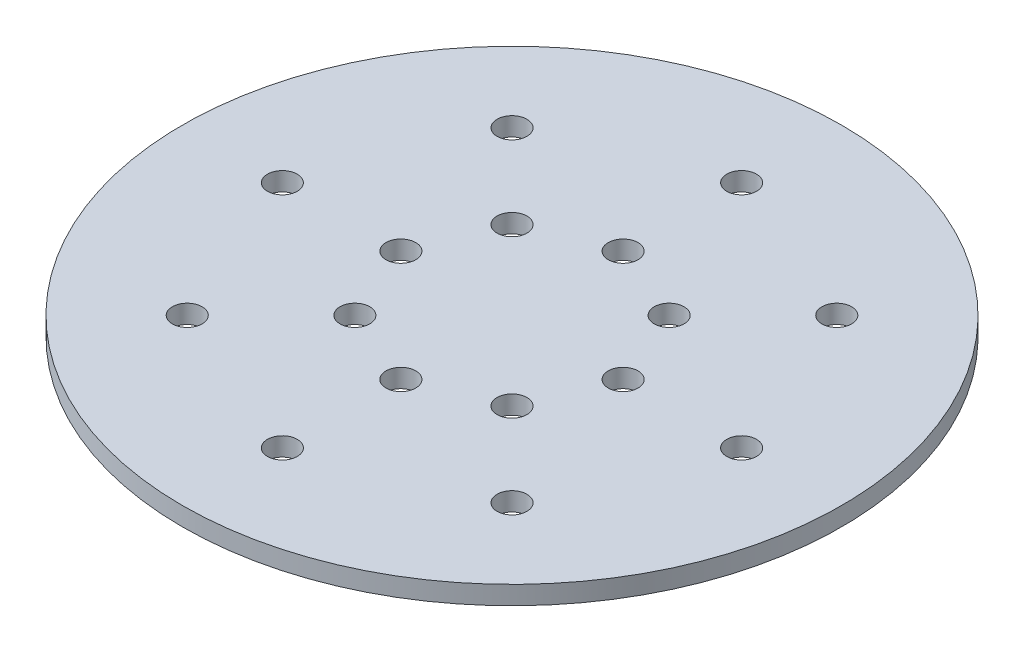
ISO-10303-21;
HEADER;
FILE_DESCRIPTION(('STEP AP214'),'2;1');
FILE_NAME('part.step','',(''),(''),'','','');
FILE_SCHEMA(('AUTOMOTIVE_DESIGN { 1 0 10303 214 1 1 1 1 }'));
ENDSEC;
DATA;
#1=APPLICATION_CONTEXT('core data for automotive mechanical design processes');
#2=APPLICATION_PROTOCOL_DEFINITION('international standard','automotive_design',2000,#1);
#3=PRODUCT_CONTEXT('',#1,'mechanical');
#4=PRODUCT('Part','Part','',(#3));
#5=PRODUCT_RELATED_PRODUCT_CATEGORY('part','',(#4));
#6=PRODUCT_DEFINITION_FORMATION('','',#4);
#7=PRODUCT_DEFINITION_CONTEXT('part definition',#1,'design');
#8=PRODUCT_DEFINITION('design','',#6,#7);
#9=PRODUCT_DEFINITION_SHAPE('','',#8);
#10=(LENGTH_UNIT() NAMED_UNIT(*) SI_UNIT(.MILLI.,.METRE.));
#11=(NAMED_UNIT(*) PLANE_ANGLE_UNIT() SI_UNIT($,.RADIAN.));
#12=(NAMED_UNIT(*) SI_UNIT($,.STERADIAN.) SOLID_ANGLE_UNIT());
#13=UNCERTAINTY_MEASURE_WITH_UNIT(LENGTH_MEASURE(1.E-05),#10,'distance_accuracy_value','');
#14=(GEOMETRIC_REPRESENTATION_CONTEXT(3) GLOBAL_UNCERTAINTY_ASSIGNED_CONTEXT((#13)) GLOBAL_UNIT_ASSIGNED_CONTEXT((#10,
#11,#12)) REPRESENTATION_CONTEXT('',''));
#15=CARTESIAN_POINT('',(0.,0.,0.));
#16=DIRECTION('',(0.,0.,1.));
#17=DIRECTION('',(1.,0.,0.));
#18=AXIS2_PLACEMENT_3D('',#15,#16,#17);
#19=CARTESIAN_POINT('',(0.,3.175,0.));
#20=DIRECTION('',(0.,-1.,0.));
#21=DIRECTION('',(0.,0.,-1.));
#22=AXIS2_PLACEMENT_3D('',#19,#20,#21);
#23=CYLINDRICAL_SURFACE('',#22,56.5);
#24=CARTESIAN_POINT('',(0.,3.175,0.));
#25=DIRECTION('',(0.,1.,0.));
#26=DIRECTION('',(0.,0.,1.));
#27=AXIS2_PLACEMENT_3D('',#24,#25,#26);
#28=CIRCLE('',#27,56.5);
#29=CARTESIAN_POINT('',(0.,3.175,56.5));
#30=VERTEX_POINT('',#29);
#31=EDGE_CURVE('E10',#30,#30,#28,.T.);
#32=ORIENTED_EDGE('',*,*,#31,.F.);
#33=EDGE_LOOP('',(#32));
#34=FACE_BOUND('',#33,.T.);
#35=CARTESIAN_POINT('',(0.,0.,0.));
#36=DIRECTION('',(0.,1.,0.));
#37=DIRECTION('',(0.,0.,1.));
#38=AXIS2_PLACEMENT_3D('',#35,#36,#37);
#39=CIRCLE('',#38,56.5);
#40=CARTESIAN_POINT('',(0.,0.,56.5));
#41=VERTEX_POINT('',#40);
#42=EDGE_CURVE('E39',#41,#41,#39,.T.);
#43=ORIENTED_EDGE('',*,*,#42,.T.);
#44=EDGE_LOOP('',(#43));
#45=FACE_BOUND('',#44,.T.);
#46=ADVANCED_FACE('F36',(#34,#45),#23,.T.);
#47=CARTESIAN_POINT('',(0.,3.175,0.));
#48=DIRECTION('',(0.,1.,0.));
#49=DIRECTION('',(0.,0.,1.));
#50=AXIS2_PLACEMENT_3D('',#47,#48,#49);
#51=PLANE('',#50);
#52=CARTESIAN_POINT('',(13.4703841816037,3.175,-13.4703841816037));
#53=DIRECTION('',(0.,-1.,0.));
#54=DIRECTION('',(0.,0.,-1.));
#55=AXIS2_PLACEMENT_3D('',#52,#53,#54);
#56=CIRCLE('',#55,2.5527);
#57=CARTESIAN_POINT('',(13.4703841816037,3.175,-16.0230841816037));
#58=VERTEX_POINT('',#57);
#59=EDGE_CURVE('E137',#58,#58,#56,.T.);
#60=ORIENTED_EDGE('',*,*,#59,.T.);
#61=EDGE_LOOP('',(#60));
#62=FACE_BOUND('',#61,.T.);
#63=CARTESIAN_POINT('',(19.05,3.175,0.));
#64=DIRECTION('',(0.,-1.,0.));
#65=DIRECTION('',(0.,0.,-1.));
#66=AXIS2_PLACEMENT_3D('',#63,#64,#65);
#67=CIRCLE('',#66,2.5527);
#68=CARTESIAN_POINT('',(19.05,3.175,-2.5527));
#69=VERTEX_POINT('',#68);
#70=EDGE_CURVE('E131',#69,#69,#67,.T.);
#71=ORIENTED_EDGE('',*,*,#70,.T.);
#72=EDGE_LOOP('',(#71));
#73=FACE_BOUND('',#72,.T.);
#74=CARTESIAN_POINT('',(13.4703841816037,3.175,13.4703841816037));
#75=DIRECTION('',(0.,-1.,0.));
#76=DIRECTION('',(0.,0.,-1.));
#77=AXIS2_PLACEMENT_3D('',#74,#75,#76);
#78=CIRCLE('',#77,2.5527);
#79=CARTESIAN_POINT('',(13.4703841816037,3.175,10.9176841816037));
#80=VERTEX_POINT('',#79);
#81=EDGE_CURVE('E125',#80,#80,#78,.T.);
#82=ORIENTED_EDGE('',*,*,#81,.T.);
#83=EDGE_LOOP('',(#82));
#84=FACE_BOUND('',#83,.T.);
#85=CARTESIAN_POINT('',(0.,3.175,19.05));
#86=DIRECTION('',(0.,-1.,0.));
#87=DIRECTION('',(0.,0.,-1.));
#88=AXIS2_PLACEMENT_3D('',#85,#86,#87);
#89=CIRCLE('',#88,2.5527);
#90=CARTESIAN_POINT('',(0.,3.175,16.4973));
#91=VERTEX_POINT('',#90);
#92=EDGE_CURVE('E119',#91,#91,#89,.T.);
#93=ORIENTED_EDGE('',*,*,#92,.T.);
#94=EDGE_LOOP('',(#93));
#95=FACE_BOUND('',#94,.T.);
#96=CARTESIAN_POINT('',(-13.4703841816037,3.175,13.4703841816037));
#97=DIRECTION('',(0.,-1.,0.));
#98=DIRECTION('',(0.,0.,-1.));
#99=AXIS2_PLACEMENT_3D('',#96,#97,#98);
#100=CIRCLE('',#99,2.5527);
#101=CARTESIAN_POINT('',(-13.4703841816037,3.175,10.9176841816037));
#102=VERTEX_POINT('',#101);
#103=EDGE_CURVE('E113',#102,#102,#100,.T.);
#104=ORIENTED_EDGE('',*,*,#103,.T.);
#105=EDGE_LOOP('',(#104));
#106=FACE_BOUND('',#105,.T.);
#107=CARTESIAN_POINT('',(-19.05,3.175,0.));
#108=DIRECTION('',(0.,-1.,0.));
#109=DIRECTION('',(0.,0.,-1.));
#110=AXIS2_PLACEMENT_3D('',#107,#108,#109);
#111=CIRCLE('',#110,2.5527);
#112=CARTESIAN_POINT('',(-19.05,3.175,-2.55269999999999));
#113=VERTEX_POINT('',#112);
#114=EDGE_CURVE('E107',#113,#113,#111,.T.);
#115=ORIENTED_EDGE('',*,*,#114,.T.);
#116=EDGE_LOOP('',(#115));
#117=FACE_BOUND('',#116,.T.);
#118=CARTESIAN_POINT('',(-13.4703841816037,3.175,-13.4703841816037));
#119=DIRECTION('',(0.,-1.,0.));
#120=DIRECTION('',(0.,0.,-1.));
#121=AXIS2_PLACEMENT_3D('',#118,#119,#120);
#122=CIRCLE('',#121,2.5527);
#123=CARTESIAN_POINT('',(-13.4703841816037,3.175,-16.0230841816037));
#124=VERTEX_POINT('',#123);
#125=EDGE_CURVE('E101',#124,#124,#122,.T.);
#126=ORIENTED_EDGE('',*,*,#125,.T.);
#127=EDGE_LOOP('',(#126));
#128=FACE_BOUND('',#127,.T.);
#129=CARTESIAN_POINT('',(0.,3.175,-19.05));
#130=DIRECTION('',(0.,-1.,0.));
#131=DIRECTION('',(0.,0.,-1.));
#132=AXIS2_PLACEMENT_3D('',#129,#130,#131);
#133=CIRCLE('',#132,2.5527);
#134=CARTESIAN_POINT('',(0.,3.175,-21.6027));
#135=VERTEX_POINT('',#134);
#136=EDGE_CURVE('E95',#135,#135,#133,.T.);
#137=ORIENTED_EDGE('',*,*,#136,.T.);
#138=EDGE_LOOP('',(#137));
#139=FACE_BOUND('',#138,.T.);
#140=CARTESIAN_POINT('',(0.,3.175,-39.37));
#141=DIRECTION('',(0.,-1.,0.));
#142=DIRECTION('',(0.,0.,-1.));
#143=AXIS2_PLACEMENT_3D('',#140,#141,#142);
#144=CIRCLE('',#143,2.5527);
#145=CARTESIAN_POINT('',(0.,3.175,-41.9227));
#146=VERTEX_POINT('',#145);
#147=EDGE_CURVE('E89',#146,#146,#144,.T.);
#148=ORIENTED_EDGE('',*,*,#147,.T.);
#149=EDGE_LOOP('',(#148));
#150=FACE_BOUND('',#149,.T.);
#151=CARTESIAN_POINT('',(-27.8387939753144,3.175,-27.8387939753144));
#152=DIRECTION('',(0.,-1.,0.));
#153=DIRECTION('',(0.,0.,-1.));
#154=AXIS2_PLACEMENT_3D('',#151,#152,#153);
#155=CIRCLE('',#154,2.5527);
#156=CARTESIAN_POINT('',(-27.8387939753144,3.175,-30.3914939753144));
#157=VERTEX_POINT('',#156);
#158=EDGE_CURVE('E83',#157,#157,#155,.T.);
#159=ORIENTED_EDGE('',*,*,#158,.T.);
#160=EDGE_LOOP('',(#159));
#161=FACE_BOUND('',#160,.T.);
#162=CARTESIAN_POINT('',(-39.37,3.175,0.));
#163=DIRECTION('',(0.,-1.,0.));
#164=DIRECTION('',(0.,0.,-1.));
#165=AXIS2_PLACEMENT_3D('',#162,#163,#164);
#166=CIRCLE('',#165,2.5527);
#167=CARTESIAN_POINT('',(-39.37,3.175,-2.55269999999999));
#168=VERTEX_POINT('',#167);
#169=EDGE_CURVE('E77',#168,#168,#166,.T.);
#170=ORIENTED_EDGE('',*,*,#169,.T.);
#171=EDGE_LOOP('',(#170));
#172=FACE_BOUND('',#171,.T.);
#173=CARTESIAN_POINT('',(-27.8387939753144,3.175,27.8387939753144));
#174=DIRECTION('',(0.,-1.,0.));
#175=DIRECTION('',(0.,0.,-1.));
#176=AXIS2_PLACEMENT_3D('',#173,#174,#175);
#177=CIRCLE('',#176,2.5527);
#178=CARTESIAN_POINT('',(-27.8387939753144,3.175,25.2860939753144));
#179=VERTEX_POINT('',#178);
#180=EDGE_CURVE('E71',#179,#179,#177,.T.);
#181=ORIENTED_EDGE('',*,*,#180,.T.);
#182=EDGE_LOOP('',(#181));
#183=FACE_BOUND('',#182,.T.);
#184=CARTESIAN_POINT('',(0.,3.175,39.37));
#185=DIRECTION('',(0.,-1.,0.));
#186=DIRECTION('',(0.,0.,-1.));
#187=AXIS2_PLACEMENT_3D('',#184,#185,#186);
#188=CIRCLE('',#187,2.5527);
#189=CARTESIAN_POINT('',(0.,3.175,36.8173));
#190=VERTEX_POINT('',#189);
#191=EDGE_CURVE('E65',#190,#190,#188,.T.);
#192=ORIENTED_EDGE('',*,*,#191,.T.);
#193=EDGE_LOOP('',(#192));
#194=FACE_BOUND('',#193,.T.);
#195=CARTESIAN_POINT('',(27.8387939753144,3.175,27.8387939753144));
#196=DIRECTION('',(0.,-1.,0.));
#197=DIRECTION('',(0.,0.,-1.));
#198=AXIS2_PLACEMENT_3D('',#195,#196,#197);
#199=CIRCLE('',#198,2.5527);
#200=CARTESIAN_POINT('',(27.8387939753144,3.175,25.2860939753144));
#201=VERTEX_POINT('',#200);
#202=EDGE_CURVE('E59',#201,#201,#199,.T.);
#203=ORIENTED_EDGE('',*,*,#202,.T.);
#204=EDGE_LOOP('',(#203));
#205=FACE_BOUND('',#204,.T.);
#206=CARTESIAN_POINT('',(39.37,3.175,0.));
#207=DIRECTION('',(0.,-1.,0.));
#208=DIRECTION('',(0.,0.,-1.));
#209=AXIS2_PLACEMENT_3D('',#206,#207,#208);
#210=CIRCLE('',#209,2.5527);
#211=CARTESIAN_POINT('',(39.37,3.175,-2.5527));
#212=VERTEX_POINT('',#211);
#213=EDGE_CURVE('E53',#212,#212,#210,.T.);
#214=ORIENTED_EDGE('',*,*,#213,.T.);
#215=EDGE_LOOP('',(#214));
#216=FACE_BOUND('',#215,.T.);
#217=CARTESIAN_POINT('',(27.8387939753144,3.175,-27.8387939753144));
#218=DIRECTION('',(0.,-1.,0.));
#219=DIRECTION('',(0.,0.,-1.));
#220=AXIS2_PLACEMENT_3D('',#217,#218,#219);
#221=CIRCLE('',#220,2.5527);
#222=CARTESIAN_POINT('',(27.8387939753144,3.175,-30.3914939753144));
#223=VERTEX_POINT('',#222);
#224=EDGE_CURVE('E46',#223,#223,#221,.T.);
#225=ORIENTED_EDGE('',*,*,#224,.T.);
#226=EDGE_LOOP('',(#225));
#227=FACE_BOUND('',#226,.T.);
#228=ORIENTED_EDGE('',*,*,#31,.T.);
#229=EDGE_LOOP('',(#228));
#230=FACE_BOUND('',#229,.T.);
#231=ADVANCED_FACE('F150',(#62,#73,#84,#95,#106,#117,#128,#139,#150,#161,#172,#183,#194,#205,
#216,#227,#230),#51,.T.);
#232=CARTESIAN_POINT('',(0.,0.,0.));
#233=DIRECTION('',(0.,1.,0.));
#234=DIRECTION('',(0.,0.,1.));
#235=AXIS2_PLACEMENT_3D('',#232,#233,#234);
#236=PLANE('',#235);
#237=CARTESIAN_POINT('',(13.4703841816037,0.,-13.4703841816037));
#238=DIRECTION('',(0.,-1.,0.));
#239=DIRECTION('',(0.,0.,-1.));
#240=AXIS2_PLACEMENT_3D('',#237,#238,#239);
#241=CIRCLE('',#240,2.5527);
#242=CARTESIAN_POINT('',(13.4703841816037,0.,-16.0230841816037));
#243=VERTEX_POINT('',#242);
#244=EDGE_CURVE('E140',#243,#243,#241,.T.);
#245=ORIENTED_EDGE('',*,*,#244,.F.);
#246=EDGE_LOOP('',(#245));
#247=FACE_BOUND('',#246,.T.);
#248=CARTESIAN_POINT('',(19.05,0.,0.));
#249=DIRECTION('',(0.,-1.,0.));
#250=DIRECTION('',(0.,0.,-1.));
#251=AXIS2_PLACEMENT_3D('',#248,#249,#250);
#252=CIRCLE('',#251,2.5527);
#253=CARTESIAN_POINT('',(19.05,0.,-2.5527));
#254=VERTEX_POINT('',#253);
#255=EDGE_CURVE('E134',#254,#254,#252,.T.);
#256=ORIENTED_EDGE('',*,*,#255,.F.);
#257=EDGE_LOOP('',(#256));
#258=FACE_BOUND('',#257,.T.);
#259=CARTESIAN_POINT('',(13.4703841816037,0.,13.4703841816037));
#260=DIRECTION('',(0.,-1.,0.));
#261=DIRECTION('',(0.,0.,-1.));
#262=AXIS2_PLACEMENT_3D('',#259,#260,#261);
#263=CIRCLE('',#262,2.5527);
#264=CARTESIAN_POINT('',(13.4703841816037,0.,10.9176841816037));
#265=VERTEX_POINT('',#264);
#266=EDGE_CURVE('E128',#265,#265,#263,.T.);
#267=ORIENTED_EDGE('',*,*,#266,.F.);
#268=EDGE_LOOP('',(#267));
#269=FACE_BOUND('',#268,.T.);
#270=CARTESIAN_POINT('',(0.,0.,19.05));
#271=DIRECTION('',(0.,-1.,0.));
#272=DIRECTION('',(0.,0.,-1.));
#273=AXIS2_PLACEMENT_3D('',#270,#271,#272);
#274=CIRCLE('',#273,2.5527);
#275=CARTESIAN_POINT('',(0.,0.,16.4973));
#276=VERTEX_POINT('',#275);
#277=EDGE_CURVE('E122',#276,#276,#274,.T.);
#278=ORIENTED_EDGE('',*,*,#277,.F.);
#279=EDGE_LOOP('',(#278));
#280=FACE_BOUND('',#279,.T.);
#281=CARTESIAN_POINT('',(-13.4703841816037,0.,13.4703841816037));
#282=DIRECTION('',(0.,-1.,0.));
#283=DIRECTION('',(0.,0.,-1.));
#284=AXIS2_PLACEMENT_3D('',#281,#282,#283);
#285=CIRCLE('',#284,2.5527);
#286=CARTESIAN_POINT('',(-13.4703841816037,0.,10.9176841816037));
#287=VERTEX_POINT('',#286);
#288=EDGE_CURVE('E116',#287,#287,#285,.T.);
#289=ORIENTED_EDGE('',*,*,#288,.F.);
#290=EDGE_LOOP('',(#289));
#291=FACE_BOUND('',#290,.T.);
#292=CARTESIAN_POINT('',(-19.05,0.,0.));
#293=DIRECTION('',(0.,-1.,0.));
#294=DIRECTION('',(0.,0.,-1.));
#295=AXIS2_PLACEMENT_3D('',#292,#293,#294);
#296=CIRCLE('',#295,2.5527);
#297=CARTESIAN_POINT('',(-19.05,0.,-2.55269999999999));
#298=VERTEX_POINT('',#297);
#299=EDGE_CURVE('E110',#298,#298,#296,.T.);
#300=ORIENTED_EDGE('',*,*,#299,.F.);
#301=EDGE_LOOP('',(#300));
#302=FACE_BOUND('',#301,.T.);
#303=CARTESIAN_POINT('',(-13.4703841816037,0.,-13.4703841816037));
#304=DIRECTION('',(0.,-1.,0.));
#305=DIRECTION('',(0.,0.,-1.));
#306=AXIS2_PLACEMENT_3D('',#303,#304,#305);
#307=CIRCLE('',#306,2.5527);
#308=CARTESIAN_POINT('',(-13.4703841816037,0.,-16.0230841816037));
#309=VERTEX_POINT('',#308);
#310=EDGE_CURVE('E104',#309,#309,#307,.T.);
#311=ORIENTED_EDGE('',*,*,#310,.F.);
#312=EDGE_LOOP('',(#311));
#313=FACE_BOUND('',#312,.T.);
#314=CARTESIAN_POINT('',(0.,0.,-19.05));
#315=DIRECTION('',(0.,-1.,0.));
#316=DIRECTION('',(0.,0.,-1.));
#317=AXIS2_PLACEMENT_3D('',#314,#315,#316);
#318=CIRCLE('',#317,2.5527);
#319=CARTESIAN_POINT('',(0.,0.,-21.6027));
#320=VERTEX_POINT('',#319);
#321=EDGE_CURVE('E98',#320,#320,#318,.T.);
#322=ORIENTED_EDGE('',*,*,#321,.F.);
#323=EDGE_LOOP('',(#322));
#324=FACE_BOUND('',#323,.T.);
#325=CARTESIAN_POINT('',(0.,0.,-39.37));
#326=DIRECTION('',(0.,-1.,0.));
#327=DIRECTION('',(0.,0.,-1.));
#328=AXIS2_PLACEMENT_3D('',#325,#326,#327);
#329=CIRCLE('',#328,2.5527);
#330=CARTESIAN_POINT('',(0.,0.,-41.9227));
#331=VERTEX_POINT('',#330);
#332=EDGE_CURVE('E92',#331,#331,#329,.T.);
#333=ORIENTED_EDGE('',*,*,#332,.F.);
#334=EDGE_LOOP('',(#333));
#335=FACE_BOUND('',#334,.T.);
#336=CARTESIAN_POINT('',(-27.8387939753144,0.,-27.8387939753144));
#337=DIRECTION('',(0.,-1.,0.));
#338=DIRECTION('',(0.,0.,-1.));
#339=AXIS2_PLACEMENT_3D('',#336,#337,#338);
#340=CIRCLE('',#339,2.5527);
#341=CARTESIAN_POINT('',(-27.8387939753144,0.,-30.3914939753144));
#342=VERTEX_POINT('',#341);
#343=EDGE_CURVE('E86',#342,#342,#340,.T.);
#344=ORIENTED_EDGE('',*,*,#343,.F.);
#345=EDGE_LOOP('',(#344));
#346=FACE_BOUND('',#345,.T.);
#347=CARTESIAN_POINT('',(-39.37,0.,0.));
#348=DIRECTION('',(0.,-1.,0.));
#349=DIRECTION('',(0.,0.,-1.));
#350=AXIS2_PLACEMENT_3D('',#347,#348,#349);
#351=CIRCLE('',#350,2.5527);
#352=CARTESIAN_POINT('',(-39.37,0.,-2.55269999999999));
#353=VERTEX_POINT('',#352);
#354=EDGE_CURVE('E80',#353,#353,#351,.T.);
#355=ORIENTED_EDGE('',*,*,#354,.F.);
#356=EDGE_LOOP('',(#355));
#357=FACE_BOUND('',#356,.T.);
#358=CARTESIAN_POINT('',(-27.8387939753144,0.,27.8387939753144));
#359=DIRECTION('',(0.,-1.,0.));
#360=DIRECTION('',(0.,0.,-1.));
#361=AXIS2_PLACEMENT_3D('',#358,#359,#360);
#362=CIRCLE('',#361,2.5527);
#363=CARTESIAN_POINT('',(-27.8387939753144,0.,25.2860939753144));
#364=VERTEX_POINT('',#363);
#365=EDGE_CURVE('E74',#364,#364,#362,.T.);
#366=ORIENTED_EDGE('',*,*,#365,.F.);
#367=EDGE_LOOP('',(#366));
#368=FACE_BOUND('',#367,.T.);
#369=CARTESIAN_POINT('',(0.,0.,39.37));
#370=DIRECTION('',(0.,-1.,0.));
#371=DIRECTION('',(0.,0.,-1.));
#372=AXIS2_PLACEMENT_3D('',#369,#370,#371);
#373=CIRCLE('',#372,2.5527);
#374=CARTESIAN_POINT('',(0.,0.,36.8173));
#375=VERTEX_POINT('',#374);
#376=EDGE_CURVE('E68',#375,#375,#373,.T.);
#377=ORIENTED_EDGE('',*,*,#376,.F.);
#378=EDGE_LOOP('',(#377));
#379=FACE_BOUND('',#378,.T.);
#380=CARTESIAN_POINT('',(27.8387939753144,0.,27.8387939753144));
#381=DIRECTION('',(0.,-1.,0.));
#382=DIRECTION('',(0.,0.,-1.));
#383=AXIS2_PLACEMENT_3D('',#380,#381,#382);
#384=CIRCLE('',#383,2.5527);
#385=CARTESIAN_POINT('',(27.8387939753144,0.,25.2860939753144));
#386=VERTEX_POINT('',#385);
#387=EDGE_CURVE('E62',#386,#386,#384,.T.);
#388=ORIENTED_EDGE('',*,*,#387,.F.);
#389=EDGE_LOOP('',(#388));
#390=FACE_BOUND('',#389,.T.);
#391=CARTESIAN_POINT('',(39.37,0.,0.));
#392=DIRECTION('',(0.,-1.,0.));
#393=DIRECTION('',(0.,0.,-1.));
#394=AXIS2_PLACEMENT_3D('',#391,#392,#393);
#395=CIRCLE('',#394,2.5527);
#396=CARTESIAN_POINT('',(39.37,0.,-2.5527));
#397=VERTEX_POINT('',#396);
#398=EDGE_CURVE('E56',#397,#397,#395,.T.);
#399=ORIENTED_EDGE('',*,*,#398,.F.);
#400=EDGE_LOOP('',(#399));
#401=FACE_BOUND('',#400,.T.);
#402=CARTESIAN_POINT('',(27.8387939753144,0.,-27.8387939753144));
#403=DIRECTION('',(0.,-1.,0.));
#404=DIRECTION('',(0.,0.,-1.));
#405=AXIS2_PLACEMENT_3D('',#402,#403,#404);
#406=CIRCLE('',#405,2.5527);
#407=CARTESIAN_POINT('',(27.8387939753144,0.,-30.3914939753144));
#408=VERTEX_POINT('',#407);
#409=EDGE_CURVE('E50',#408,#408,#406,.T.);
#410=ORIENTED_EDGE('',*,*,#409,.F.);
#411=EDGE_LOOP('',(#410));
#412=FACE_BOUND('',#411,.T.);
#413=ORIENTED_EDGE('',*,*,#42,.F.);
#414=EDGE_LOOP('',(#413));
#415=FACE_BOUND('',#414,.T.);
#416=ADVANCED_FACE('F146',(#247,#258,#269,#280,#291,#302,#313,#324,#335,#346,#357,#368,#379,
#390,#401,#412,#415),#236,.F.);
#417=CARTESIAN_POINT('',(27.8387939753144,0.,-27.8387939753144));
#418=DIRECTION('',(0.,-1.,0.));
#419=DIRECTION('',(0.,0.,-1.));
#420=AXIS2_PLACEMENT_3D('',#417,#418,#419);
#421=CYLINDRICAL_SURFACE('',#420,2.5527);
#422=ORIENTED_EDGE('',*,*,#224,.F.);
#423=EDGE_LOOP('',(#422));
#424=FACE_BOUND('',#423,.T.);
#425=ORIENTED_EDGE('',*,*,#409,.T.);
#426=EDGE_LOOP('',(#425));
#427=FACE_BOUND('',#426,.T.);
#428=ADVANCED_FACE('F149',(#424,#427),#421,.F.);
#429=CARTESIAN_POINT('',(39.37,0.,0.));
#430=DIRECTION('',(0.,-1.,0.));
#431=DIRECTION('',(0.,0.,-1.));
#432=AXIS2_PLACEMENT_3D('',#429,#430,#431);
#433=CYLINDRICAL_SURFACE('',#432,2.5527);
#434=ORIENTED_EDGE('',*,*,#213,.F.);
#435=EDGE_LOOP('',(#434));
#436=FACE_BOUND('',#435,.T.);
#437=ORIENTED_EDGE('',*,*,#398,.T.);
#438=EDGE_LOOP('',(#437));
#439=FACE_BOUND('',#438,.T.);
#440=ADVANCED_FACE('F196',(#436,#439),#433,.F.);
#441=CARTESIAN_POINT('',(27.8387939753144,0.,27.8387939753144));
#442=DIRECTION('',(0.,-1.,0.));
#443=DIRECTION('',(0.,0.,-1.));
#444=AXIS2_PLACEMENT_3D('',#441,#442,#443);
#445=CYLINDRICAL_SURFACE('',#444,2.5527);
#446=ORIENTED_EDGE('',*,*,#202,.F.);
#447=EDGE_LOOP('',(#446));
#448=FACE_BOUND('',#447,.T.);
#449=ORIENTED_EDGE('',*,*,#387,.T.);
#450=EDGE_LOOP('',(#449));
#451=FACE_BOUND('',#450,.T.);
#452=ADVANCED_FACE('F200',(#448,#451),#445,.F.);
#453=CARTESIAN_POINT('',(0.,0.,39.37));
#454=DIRECTION('',(0.,-1.,0.));
#455=DIRECTION('',(0.,0.,-1.));
#456=AXIS2_PLACEMENT_3D('',#453,#454,#455);
#457=CYLINDRICAL_SURFACE('',#456,2.5527);
#458=ORIENTED_EDGE('',*,*,#191,.F.);
#459=EDGE_LOOP('',(#458));
#460=FACE_BOUND('',#459,.T.);
#461=ORIENTED_EDGE('',*,*,#376,.T.);
#462=EDGE_LOOP('',(#461));
#463=FACE_BOUND('',#462,.T.);
#464=ADVANCED_FACE('F204',(#460,#463),#457,.F.);
#465=CARTESIAN_POINT('',(-27.8387939753144,0.,27.8387939753144));
#466=DIRECTION('',(0.,-1.,0.));
#467=DIRECTION('',(0.,0.,-1.));
#468=AXIS2_PLACEMENT_3D('',#465,#466,#467);
#469=CYLINDRICAL_SURFACE('',#468,2.5527);
#470=ORIENTED_EDGE('',*,*,#180,.F.);
#471=EDGE_LOOP('',(#470));
#472=FACE_BOUND('',#471,.T.);
#473=ORIENTED_EDGE('',*,*,#365,.T.);
#474=EDGE_LOOP('',(#473));
#475=FACE_BOUND('',#474,.T.);
#476=ADVANCED_FACE('F208',(#472,#475),#469,.F.);
#477=CARTESIAN_POINT('',(-39.37,0.,0.));
#478=DIRECTION('',(0.,-1.,0.));
#479=DIRECTION('',(0.,0.,-1.));
#480=AXIS2_PLACEMENT_3D('',#477,#478,#479);
#481=CYLINDRICAL_SURFACE('',#480,2.5527);
#482=ORIENTED_EDGE('',*,*,#169,.F.);
#483=EDGE_LOOP('',(#482));
#484=FACE_BOUND('',#483,.T.);
#485=ORIENTED_EDGE('',*,*,#354,.T.);
#486=EDGE_LOOP('',(#485));
#487=FACE_BOUND('',#486,.T.);
#488=ADVANCED_FACE('F212',(#484,#487),#481,.F.);
#489=CARTESIAN_POINT('',(-27.8387939753144,0.,-27.8387939753144));
#490=DIRECTION('',(0.,-1.,0.));
#491=DIRECTION('',(0.,0.,-1.));
#492=AXIS2_PLACEMENT_3D('',#489,#490,#491);
#493=CYLINDRICAL_SURFACE('',#492,2.5527);
#494=ORIENTED_EDGE('',*,*,#158,.F.);
#495=EDGE_LOOP('',(#494));
#496=FACE_BOUND('',#495,.T.);
#497=ORIENTED_EDGE('',*,*,#343,.T.);
#498=EDGE_LOOP('',(#497));
#499=FACE_BOUND('',#498,.T.);
#500=ADVANCED_FACE('F216',(#496,#499),#493,.F.);
#501=CARTESIAN_POINT('',(0.,0.,-39.37));
#502=DIRECTION('',(0.,-1.,0.));
#503=DIRECTION('',(0.,0.,-1.));
#504=AXIS2_PLACEMENT_3D('',#501,#502,#503);
#505=CYLINDRICAL_SURFACE('',#504,2.5527);
#506=ORIENTED_EDGE('',*,*,#147,.F.);
#507=EDGE_LOOP('',(#506));
#508=FACE_BOUND('',#507,.T.);
#509=ORIENTED_EDGE('',*,*,#332,.T.);
#510=EDGE_LOOP('',(#509));
#511=FACE_BOUND('',#510,.T.);
#512=ADVANCED_FACE('F220',(#508,#511),#505,.F.);
#513=CARTESIAN_POINT('',(0.,0.,-19.05));
#514=DIRECTION('',(0.,-1.,0.));
#515=DIRECTION('',(0.,0.,-1.));
#516=AXIS2_PLACEMENT_3D('',#513,#514,#515);
#517=CYLINDRICAL_SURFACE('',#516,2.5527);
#518=ORIENTED_EDGE('',*,*,#136,.F.);
#519=EDGE_LOOP('',(#518));
#520=FACE_BOUND('',#519,.T.);
#521=ORIENTED_EDGE('',*,*,#321,.T.);
#522=EDGE_LOOP('',(#521));
#523=FACE_BOUND('',#522,.T.);
#524=ADVANCED_FACE('F224',(#520,#523),#517,.F.);
#525=CARTESIAN_POINT('',(-13.4703841816037,0.,-13.4703841816037));
#526=DIRECTION('',(0.,-1.,0.));
#527=DIRECTION('',(0.,0.,-1.));
#528=AXIS2_PLACEMENT_3D('',#525,#526,#527);
#529=CYLINDRICAL_SURFACE('',#528,2.5527);
#530=ORIENTED_EDGE('',*,*,#125,.F.);
#531=EDGE_LOOP('',(#530));
#532=FACE_BOUND('',#531,.T.);
#533=ORIENTED_EDGE('',*,*,#310,.T.);
#534=EDGE_LOOP('',(#533));
#535=FACE_BOUND('',#534,.T.);
#536=ADVANCED_FACE('F228',(#532,#535),#529,.F.);
#537=CARTESIAN_POINT('',(-19.05,0.,0.));
#538=DIRECTION('',(0.,-1.,0.));
#539=DIRECTION('',(0.,0.,-1.));
#540=AXIS2_PLACEMENT_3D('',#537,#538,#539);
#541=CYLINDRICAL_SURFACE('',#540,2.5527);
#542=ORIENTED_EDGE('',*,*,#114,.F.);
#543=EDGE_LOOP('',(#542));
#544=FACE_BOUND('',#543,.T.);
#545=ORIENTED_EDGE('',*,*,#299,.T.);
#546=EDGE_LOOP('',(#545));
#547=FACE_BOUND('',#546,.T.);
#548=ADVANCED_FACE('F232',(#544,#547),#541,.F.);
#549=CARTESIAN_POINT('',(-13.4703841816037,0.,13.4703841816037));
#550=DIRECTION('',(0.,-1.,0.));
#551=DIRECTION('',(0.,0.,-1.));
#552=AXIS2_PLACEMENT_3D('',#549,#550,#551);
#553=CYLINDRICAL_SURFACE('',#552,2.5527);
#554=ORIENTED_EDGE('',*,*,#103,.F.);
#555=EDGE_LOOP('',(#554));
#556=FACE_BOUND('',#555,.T.);
#557=ORIENTED_EDGE('',*,*,#288,.T.);
#558=EDGE_LOOP('',(#557));
#559=FACE_BOUND('',#558,.T.);
#560=ADVANCED_FACE('F236',(#556,#559),#553,.F.);
#561=CARTESIAN_POINT('',(0.,0.,19.05));
#562=DIRECTION('',(0.,-1.,0.));
#563=DIRECTION('',(0.,0.,-1.));
#564=AXIS2_PLACEMENT_3D('',#561,#562,#563);
#565=CYLINDRICAL_SURFACE('',#564,2.5527);
#566=ORIENTED_EDGE('',*,*,#92,.F.);
#567=EDGE_LOOP('',(#566));
#568=FACE_BOUND('',#567,.T.);
#569=ORIENTED_EDGE('',*,*,#277,.T.);
#570=EDGE_LOOP('',(#569));
#571=FACE_BOUND('',#570,.T.);
#572=ADVANCED_FACE('F240',(#568,#571),#565,.F.);
#573=CARTESIAN_POINT('',(13.4703841816037,0.,13.4703841816037));
#574=DIRECTION('',(0.,-1.,0.));
#575=DIRECTION('',(0.,0.,-1.));
#576=AXIS2_PLACEMENT_3D('',#573,#574,#575);
#577=CYLINDRICAL_SURFACE('',#576,2.5527);
#578=ORIENTED_EDGE('',*,*,#81,.F.);
#579=EDGE_LOOP('',(#578));
#580=FACE_BOUND('',#579,.T.);
#581=ORIENTED_EDGE('',*,*,#266,.T.);
#582=EDGE_LOOP('',(#581));
#583=FACE_BOUND('',#582,.T.);
#584=ADVANCED_FACE('F244',(#580,#583),#577,.F.);
#585=CARTESIAN_POINT('',(19.05,0.,0.));
#586=DIRECTION('',(0.,-1.,0.));
#587=DIRECTION('',(0.,0.,-1.));
#588=AXIS2_PLACEMENT_3D('',#585,#586,#587);
#589=CYLINDRICAL_SURFACE('',#588,2.5527);
#590=ORIENTED_EDGE('',*,*,#70,.F.);
#591=EDGE_LOOP('',(#590));
#592=FACE_BOUND('',#591,.T.);
#593=ORIENTED_EDGE('',*,*,#255,.T.);
#594=EDGE_LOOP('',(#593));
#595=FACE_BOUND('',#594,.T.);
#596=ADVANCED_FACE('F248',(#592,#595),#589,.F.);
#597=CARTESIAN_POINT('',(13.4703841816037,0.,-13.4703841816037));
#598=DIRECTION('',(0.,-1.,0.));
#599=DIRECTION('',(0.,0.,-1.));
#600=AXIS2_PLACEMENT_3D('',#597,#598,#599);
#601=CYLINDRICAL_SURFACE('',#600,2.5527);
#602=ORIENTED_EDGE('',*,*,#59,.F.);
#603=EDGE_LOOP('',(#602));
#604=FACE_BOUND('',#603,.T.);
#605=ORIENTED_EDGE('',*,*,#244,.T.);
#606=EDGE_LOOP('',(#605));
#607=FACE_BOUND('',#606,.T.);
#608=ADVANCED_FACE('F144',(#604,#607),#601,.F.);
#609=CLOSED_SHELL('',(#46,#231,#416,#428,#440,#452,#464,#476,#488,#500,#512,#524,#536,#548,#560,
#572,#584,#596,#608));
#610=MANIFOLD_SOLID_BREP('B2',#609);
#611=ADVANCED_BREP_SHAPE_REPRESENTATION('',(#18,#610),#14);
#612=SHAPE_DEFINITION_REPRESENTATION(#9,#611);
ENDSEC;
END-ISO-10303-21;
